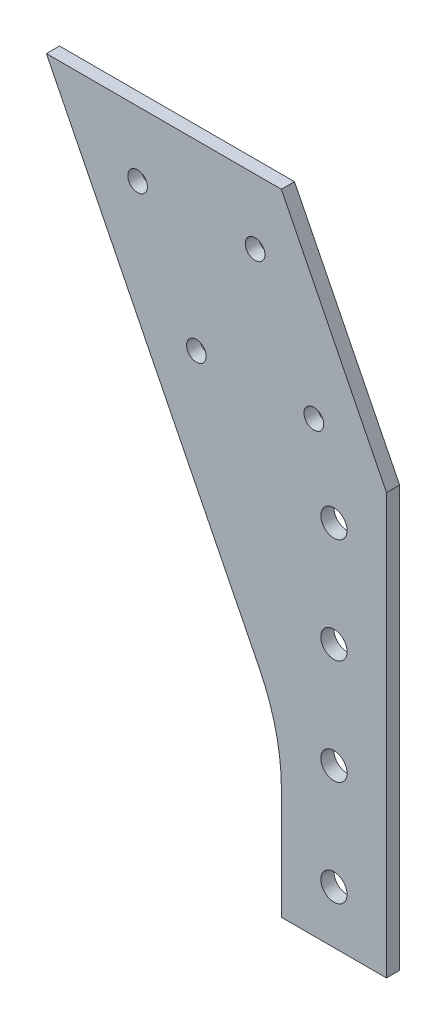
ISO-10303-21;
HEADER;
FILE_DESCRIPTION(('STEP AP214'),'2;1');
FILE_NAME('part.step','',(''),(''),'','','');
FILE_SCHEMA(('AUTOMOTIVE_DESIGN { 1 0 10303 214 1 1 1 1 }'));
ENDSEC;
DATA;
#1=APPLICATION_CONTEXT('core data for automotive mechanical design processes');
#2=APPLICATION_PROTOCOL_DEFINITION('international standard','automotive_design',2000,#1);
#3=PRODUCT_CONTEXT('',#1,'mechanical');
#4=PRODUCT('Part','Part','',(#3));
#5=PRODUCT_RELATED_PRODUCT_CATEGORY('part','',(#4));
#6=PRODUCT_DEFINITION_FORMATION('','',#4);
#7=PRODUCT_DEFINITION_CONTEXT('part definition',#1,'design');
#8=PRODUCT_DEFINITION('design','',#6,#7);
#9=PRODUCT_DEFINITION_SHAPE('','',#8);
#10=(LENGTH_UNIT() NAMED_UNIT(*) SI_UNIT(.MILLI.,.METRE.));
#11=(NAMED_UNIT(*) PLANE_ANGLE_UNIT() SI_UNIT($,.RADIAN.));
#12=(NAMED_UNIT(*) SI_UNIT($,.STERADIAN.) SOLID_ANGLE_UNIT());
#13=UNCERTAINTY_MEASURE_WITH_UNIT(LENGTH_MEASURE(1.E-05),#10,'distance_accuracy_value','');
#14=(GEOMETRIC_REPRESENTATION_CONTEXT(3) GLOBAL_UNCERTAINTY_ASSIGNED_CONTEXT((#13)) GLOBAL_UNIT_ASSIGNED_CONTEXT((#10,
#11,#12)) REPRESENTATION_CONTEXT('',''));
#15=CARTESIAN_POINT('',(0.,0.,0.));
#16=DIRECTION('',(0.,0.,1.));
#17=DIRECTION('',(1.,0.,0.));
#18=AXIS2_PLACEMENT_3D('',#15,#16,#17);
#19=CARTESIAN_POINT('',(-25.1145002991139,-12.5599617930645,3.175));
#20=DIRECTION('',(0.89438856037009,0.447290848418698,0.));
#21=DIRECTION('',(-0.447290848418698,0.89438856037009,0.));
#22=AXIS2_PLACEMENT_3D('',#19,#20,#21);
#23=PLANE('',#22);
#24=DIRECTION('',(0.447290848418698,-0.89438856037009,0.));
#25=VECTOR('',#24,1.);
#26=CARTESIAN_POINT('',(-25.1145002991139,-12.5599617930645,3.175));
#27=LINE('',#26,#25);
#28=CARTESIAN_POINT('',(-69.5040647179644,76.2,3.175));
#29=VERTEX_POINT('',#28);
#30=CARTESIAN_POINT('',(-18.0650611331994,-26.6557962357064,3.175));
#31=VERTEX_POINT('',#30);
#32=EDGE_CURVE('E61',#29,#31,#27,.T.);
#33=ORIENTED_EDGE('',*,*,#32,.F.);
#34=DIRECTION('',(0.,0.,-1.));
#35=VECTOR('',#34,1.);
#36=CARTESIAN_POINT('',(-69.5040647179644,76.2,3.175));
#37=LINE('',#36,#35);
#38=CARTESIAN_POINT('',(-69.5040647179644,76.2,0.));
#39=VERTEX_POINT('',#38);
#40=EDGE_CURVE('E98',#29,#39,#37,.T.);
#41=ORIENTED_EDGE('',*,*,#40,.T.);
#42=DIRECTION('',(0.447290848418698,-0.89438856037009,0.));
#43=VECTOR('',#42,1.);
#44=CARTESIAN_POINT('',(-25.1145002991139,-12.5599617930645,0.));
#45=LINE('',#44,#43);
#46=CARTESIAN_POINT('',(-18.0650611331994,-26.6557962357064,0.));
#47=VERTEX_POINT('',#46);
#48=EDGE_CURVE('E106',#39,#47,#45,.T.);
#49=ORIENTED_EDGE('',*,*,#48,.T.);
#50=DIRECTION('',(0.,0.,-1.));
#51=VECTOR('',#50,1.);
#52=CARTESIAN_POINT('',(-18.0650611331994,-26.6557962357064,3.175));
#53=LINE('',#52,#51);
#54=EDGE_CURVE('E142',#47,#31,#53,.F.);
#55=ORIENTED_EDGE('',*,*,#54,.T.);
#56=EDGE_LOOP('',(#33,#41,#49,#55));
#57=FACE_BOUND('',#56,.T.);
#58=ADVANCED_FACE('F39',(#57),#23,.F.);
#59=CARTESIAN_POINT('',(-12.7,0.,3.175));
#60=DIRECTION('',(1.,0.,0.));
#61=DIRECTION('',(0.,1.,0.));
#62=AXIS2_PLACEMENT_3D('',#59,#60,#61);
#63=PLANE('',#62);
#64=DIRECTION('',(0.,-1.,0.));
#65=VECTOR('',#64,1.);
#66=CARTESIAN_POINT('',(-12.7,0.,3.175));
#67=LINE('',#66,#65);
#68=CARTESIAN_POINT('',(-12.7,-49.3781713353763,3.175));
#69=VERTEX_POINT('',#68);
#70=CARTESIAN_POINT('',(-12.7,-76.2,3.175));
#71=VERTEX_POINT('',#70);
#72=EDGE_CURVE('E149',#69,#71,#67,.T.);
#73=ORIENTED_EDGE('',*,*,#72,.F.);
#74=DIRECTION('',(0.,0.,-1.));
#75=VECTOR('',#74,1.);
#76=CARTESIAN_POINT('',(-12.7,-49.3781713353763,0.));
#77=LINE('',#76,#75);
#78=CARTESIAN_POINT('',(-12.7,-49.3781713353763,0.));
#79=VERTEX_POINT('',#78);
#80=EDGE_CURVE('E139',#69,#79,#77,.T.);
#81=ORIENTED_EDGE('',*,*,#80,.T.);
#82=DIRECTION('',(0.,-1.,0.));
#83=VECTOR('',#82,1.);
#84=CARTESIAN_POINT('',(-12.7,0.,0.));
#85=LINE('',#84,#83);
#86=CARTESIAN_POINT('',(-12.7,-76.2,0.));
#87=VERTEX_POINT('',#86);
#88=EDGE_CURVE('E113',#79,#87,#85,.T.);
#89=ORIENTED_EDGE('',*,*,#88,.T.);
#90=DIRECTION('',(0.,0.,-1.));
#91=VECTOR('',#90,1.);
#92=CARTESIAN_POINT('',(-12.7,-76.2,3.175));
#93=LINE('',#92,#91);
#94=EDGE_CURVE('E136',#71,#87,#93,.T.);
#95=ORIENTED_EDGE('',*,*,#94,.F.);
#96=EDGE_LOOP('',(#73,#81,#89,#95));
#97=FACE_BOUND('',#96,.T.);
#98=ADVANCED_FACE('F152',(#97),#63,.F.);
#99=CARTESIAN_POINT('',(0.,-76.2,3.175));
#100=DIRECTION('',(0.,1.,0.));
#101=DIRECTION('',(0.,0.,1.));
#102=AXIS2_PLACEMENT_3D('',#99,#100,#101);
#103=PLANE('',#102);
#104=DIRECTION('',(1.,0.,0.));
#105=VECTOR('',#104,1.);
#106=CARTESIAN_POINT('',(0.,-76.2,0.));
#107=LINE('',#106,#105);
#108=CARTESIAN_POINT('',(12.7,-76.2,0.));
#109=VERTEX_POINT('',#108);
#110=EDGE_CURVE('E116',#87,#109,#107,.T.);
#111=ORIENTED_EDGE('',*,*,#110,.T.);
#112=DIRECTION('',(0.,0.,-1.));
#113=VECTOR('',#112,1.);
#114=CARTESIAN_POINT('',(12.7,-76.2,3.175));
#115=LINE('',#114,#113);
#116=CARTESIAN_POINT('',(12.7,-76.2,3.175));
#117=VERTEX_POINT('',#116);
#118=EDGE_CURVE('E134',#117,#109,#115,.T.);
#119=ORIENTED_EDGE('',*,*,#118,.F.);
#120=DIRECTION('',(1.,0.,0.));
#121=VECTOR('',#120,1.);
#122=CARTESIAN_POINT('',(0.,-76.2,3.175));
#123=LINE('',#122,#121);
#124=EDGE_CURVE('E154',#71,#117,#123,.T.);
#125=ORIENTED_EDGE('',*,*,#124,.F.);
#126=ORIENTED_EDGE('',*,*,#94,.T.);
#127=EDGE_LOOP('',(#111,#119,#125,#126));
#128=FACE_BOUND('',#127,.T.);
#129=ADVANCED_FACE('F239',(#128),#103,.F.);
#130=CARTESIAN_POINT('',(12.7,0.,3.175));
#131=DIRECTION('',(1.,0.,0.));
#132=DIRECTION('',(0.,1.,0.));
#133=AXIS2_PLACEMENT_3D('',#130,#131,#132);
#134=PLANE('',#133);
#135=DIRECTION('',(0.,-1.,0.));
#136=VECTOR('',#135,1.);
#137=CARTESIAN_POINT('',(12.7,0.,0.));
#138=LINE('',#137,#136);
#139=CARTESIAN_POINT('',(12.7,25.4,0.));
#140=VERTEX_POINT('',#139);
#141=EDGE_CURVE('E127',#140,#109,#138,.T.);
#142=ORIENTED_EDGE('',*,*,#141,.F.);
#143=DIRECTION('',(0.,0.,-1.));
#144=VECTOR('',#143,1.);
#145=CARTESIAN_POINT('',(12.7,25.4,3.175));
#146=LINE('',#145,#144);
#147=CARTESIAN_POINT('',(12.7,25.4,3.175));
#148=VERTEX_POINT('',#147);
#149=EDGE_CURVE('E132',#148,#140,#146,.T.);
#150=ORIENTED_EDGE('',*,*,#149,.F.);
#151=DIRECTION('',(0.,-1.,0.));
#152=VECTOR('',#151,1.);
#153=CARTESIAN_POINT('',(12.7,0.,3.175));
#154=LINE('',#153,#152);
#155=EDGE_CURVE('E156',#148,#117,#154,.T.);
#156=ORIENTED_EDGE('',*,*,#155,.T.);
#157=ORIENTED_EDGE('',*,*,#118,.T.);
#158=EDGE_LOOP('',(#142,#150,#156,#157));
#159=FACE_BOUND('',#158,.T.);
#160=ADVANCED_FACE('F244',(#159),#134,.T.);
#161=CARTESIAN_POINT('',(20.3204385676866,10.1624133066053,3.175));
#162=DIRECTION('',(-0.894388560370089,-0.447290848418698,0.));
#163=DIRECTION('',(0.447290848418698,-0.89438856037009,0.));
#164=AXIS2_PLACEMENT_3D('',#161,#162,#163);
#165=PLANE('',#164);
#166=DIRECTION('',(-0.447290848418698,0.89438856037009,0.));
#167=VECTOR('',#166,1.);
#168=CARTESIAN_POINT('',(20.3204385676866,10.1624133066053,0.));
#169=LINE('',#168,#167);
#170=CARTESIAN_POINT('',(-12.7054849385233,76.2,0.));
#171=VERTEX_POINT('',#170);
#172=EDGE_CURVE('E130',#140,#171,#169,.T.);
#173=ORIENTED_EDGE('',*,*,#172,.T.);
#174=DIRECTION('',(0.,0.,1.));
#175=VECTOR('',#174,1.);
#176=CARTESIAN_POINT('',(-12.7054849385233,76.2,3.175));
#177=LINE('',#176,#175);
#178=CARTESIAN_POINT('',(-12.7054849385233,76.2,3.175));
#179=VERTEX_POINT('',#178);
#180=EDGE_CURVE('E54',#171,#179,#177,.T.);
#181=ORIENTED_EDGE('',*,*,#180,.T.);
#182=DIRECTION('',(-0.447290848418698,0.89438856037009,0.));
#183=VECTOR('',#182,1.);
#184=CARTESIAN_POINT('',(20.3204385676866,10.1624133066053,3.175));
#185=LINE('',#184,#183);
#186=EDGE_CURVE('E122',#148,#179,#185,.T.);
#187=ORIENTED_EDGE('',*,*,#186,.F.);
#188=ORIENTED_EDGE('',*,*,#149,.T.);
#189=EDGE_LOOP('',(#173,#181,#187,#188));
#190=FACE_BOUND('',#189,.T.);
#191=ADVANCED_FACE('F166',(#190),#165,.F.);
#192=CARTESIAN_POINT('',(0.,0.,3.175));
#193=DIRECTION('',(0.,0.,1.));
#194=DIRECTION('',(1.,0.,0.));
#195=AXIS2_PLACEMENT_3D('',#192,#193,#194);
#196=PLANE('',#195);
#197=DIRECTION('',(-1.,0.,0.));
#198=VECTOR('',#197,1.);
#199=CARTESIAN_POINT('',(17.2590744713261,76.2,3.175));
#200=LINE('',#199,#198);
#201=EDGE_CURVE('E103',#179,#29,#200,.T.);
#202=ORIENTED_EDGE('',*,*,#201,.T.);
#203=ORIENTED_EDGE('',*,*,#32,.T.);
#204=CARTESIAN_POINT('',(-63.5,-49.3781713353763,3.175));
#205=DIRECTION('',(0.,0.,1.));
#206=DIRECTION('',(1.,0.,0.));
#207=AXIS2_PLACEMENT_3D('',#204,#205,#206);
#208=CIRCLE('',#207,50.8);
#209=EDGE_CURVE('E11',#31,#69,#208,.F.);
#210=ORIENTED_EDGE('',*,*,#209,.T.);
#211=ORIENTED_EDGE('',*,*,#72,.T.);
#212=ORIENTED_EDGE('',*,*,#124,.T.);
#213=ORIENTED_EDGE('',*,*,#155,.F.);
#214=ORIENTED_EDGE('',*,*,#186,.T.);
#215=EDGE_LOOP('',(#202,#203,#210,#211,#212,#213,#214));
#216=FACE_BOUND('',#215,.T.);
#217=CARTESIAN_POINT('',(-4.8535322434271,32.1063264164993,3.175));
#218=DIRECTION('',(0.,0.,-1.));
#219=DIRECTION('',(-1.,0.,0.));
#220=AXIS2_PLACEMENT_3D('',#217,#218,#219);
#221=CIRCLE('',#220,2.38125);
#222=CARTESIAN_POINT('',(-7.2347822434271,32.1063264164993,3.175));
#223=VERTEX_POINT('',#222);
#224=EDGE_CURVE('E173',#223,#223,#221,.T.);
#225=ORIENTED_EDGE('',*,*,#224,.T.);
#226=EDGE_LOOP('',(#225));
#227=FACE_BOUND('',#226,.T.);
#228=CARTESIAN_POINT('',(-47.4543065704413,60.5031632082497,3.175));
#229=DIRECTION('',(0.,0.,-1.));
#230=DIRECTION('',(-1.,0.,0.));
#231=AXIS2_PLACEMENT_3D('',#228,#229,#230);
#232=CIRCLE('',#231,2.38125);
#233=CARTESIAN_POINT('',(-49.8355565704413,60.5031632082497,3.175));
#234=VERTEX_POINT('',#233);
#235=EDGE_CURVE('E180',#234,#234,#232,.T.);
#236=ORIENTED_EDGE('',*,*,#235,.T.);
#237=EDGE_LOOP('',(#236));
#238=FACE_BOUND('',#237,.T.);
#239=CARTESIAN_POINT('',(-19.0550166807208,60.5031632082497,3.175));
#240=DIRECTION('',(0.,0.,-1.));
#241=DIRECTION('',(-1.,0.,0.));
#242=AXIS2_PLACEMENT_3D('',#239,#240,#241);
#243=CIRCLE('',#242,2.38125);
#244=CARTESIAN_POINT('',(-21.4362666807208,60.5031632082497,3.175));
#245=VERTEX_POINT('',#244);
#246=EDGE_CURVE('E179',#245,#245,#243,.T.);
#247=ORIENTED_EDGE('',*,*,#246,.T.);
#248=EDGE_LOOP('',(#247));
#249=FACE_BOUND('',#248,.T.);
#250=CARTESIAN_POINT('',(-33.2528221331476,32.1063264164993,3.175));
#251=DIRECTION('',(0.,0.,-1.));
#252=DIRECTION('',(-1.,0.,0.));
#253=AXIS2_PLACEMENT_3D('',#250,#251,#252);
#254=CIRCLE('',#253,2.38125);
#255=CARTESIAN_POINT('',(-35.6340721331476,32.1063264164993,3.175));
#256=VERTEX_POINT('',#255);
#257=EDGE_CURVE('E108',#256,#256,#254,.T.);
#258=ORIENTED_EDGE('',*,*,#257,.T.);
#259=EDGE_LOOP('',(#258));
#260=FACE_BOUND('',#259,.T.);
#261=CARTESIAN_POINT('',(0.,-63.5,3.175));
#262=DIRECTION('',(0.,0.,-1.));
#263=DIRECTION('',(-1.,0.,0.));
#264=AXIS2_PLACEMENT_3D('',#261,#262,#263);
#265=CIRCLE('',#264,3.175);
#266=CARTESIAN_POINT('',(-3.17499999999999,-63.5,3.175));
#267=VERTEX_POINT('',#266);
#268=EDGE_CURVE('E114',#267,#267,#265,.T.);
#269=ORIENTED_EDGE('',*,*,#268,.T.);
#270=EDGE_LOOP('',(#269));
#271=FACE_BOUND('',#270,.T.);
#272=CARTESIAN_POINT('',(0.,-38.1,3.175));
#273=DIRECTION('',(0.,0.,-1.));
#274=DIRECTION('',(-1.,0.,0.));
#275=AXIS2_PLACEMENT_3D('',#272,#273,#274);
#276=CIRCLE('',#275,3.175);
#277=CARTESIAN_POINT('',(-3.17499999999999,-38.1,3.175));
#278=VERTEX_POINT('',#277);
#279=EDGE_CURVE('E199',#278,#278,#276,.T.);
#280=ORIENTED_EDGE('',*,*,#279,.T.);
#281=EDGE_LOOP('',(#280));
#282=FACE_BOUND('',#281,.T.);
#283=CARTESIAN_POINT('',(0.,-12.7,3.175));
#284=DIRECTION('',(0.,0.,-1.));
#285=DIRECTION('',(-1.,0.,0.));
#286=AXIS2_PLACEMENT_3D('',#283,#284,#285);
#287=CIRCLE('',#286,3.175);
#288=CARTESIAN_POINT('',(-3.17499999999999,-12.7,3.175));
#289=VERTEX_POINT('',#288);
#290=EDGE_CURVE('E205',#289,#289,#287,.T.);
#291=ORIENTED_EDGE('',*,*,#290,.T.);
#292=EDGE_LOOP('',(#291));
#293=FACE_BOUND('',#292,.T.);
#294=CARTESIAN_POINT('',(0.,12.7,3.175));
#295=DIRECTION('',(0.,0.,-1.));
#296=DIRECTION('',(-1.,0.,0.));
#297=AXIS2_PLACEMENT_3D('',#294,#295,#296);
#298=CIRCLE('',#297,3.175);
#299=CARTESIAN_POINT('',(-3.17499999999999,12.7,3.175));
#300=VERTEX_POINT('',#299);
#301=EDGE_CURVE('E191',#300,#300,#298,.T.);
#302=ORIENTED_EDGE('',*,*,#301,.T.);
#303=EDGE_LOOP('',(#302));
#304=FACE_BOUND('',#303,.T.);
#305=ADVANCED_FACE('F147',(#216,#227,#238,#249,#260,#271,#282,#293,#304),#196,.T.);
#306=CARTESIAN_POINT('',(0.,0.,0.));
#307=DIRECTION('',(0.,0.,1.));
#308=DIRECTION('',(1.,0.,0.));
#309=AXIS2_PLACEMENT_3D('',#306,#307,#308);
#310=PLANE('',#309);
#311=CARTESIAN_POINT('',(-4.8535322434271,32.1063264164993,0.));
#312=DIRECTION('',(0.,0.,-1.));
#313=DIRECTION('',(-1.,0.,0.));
#314=AXIS2_PLACEMENT_3D('',#311,#312,#313);
#315=CIRCLE('',#314,2.38125);
#316=CARTESIAN_POINT('',(-7.2347822434271,32.1063264164993,0.));
#317=VERTEX_POINT('',#316);
#318=EDGE_CURVE('E183',#317,#317,#315,.T.);
#319=ORIENTED_EDGE('',*,*,#318,.F.);
#320=EDGE_LOOP('',(#319));
#321=FACE_BOUND('',#320,.T.);
#322=CARTESIAN_POINT('',(-47.4543065704413,60.5031632082497,0.));
#323=DIRECTION('',(0.,0.,-1.));
#324=DIRECTION('',(-1.,0.,0.));
#325=AXIS2_PLACEMENT_3D('',#322,#323,#324);
#326=CIRCLE('',#325,2.38125);
#327=CARTESIAN_POINT('',(-49.8355565704413,60.5031632082497,0.));
#328=VERTEX_POINT('',#327);
#329=EDGE_CURVE('E176',#328,#328,#326,.T.);
#330=ORIENTED_EDGE('',*,*,#329,.F.);
#331=EDGE_LOOP('',(#330));
#332=FACE_BOUND('',#331,.T.);
#333=CARTESIAN_POINT('',(-19.0550166807208,60.5031632082497,0.));
#334=DIRECTION('',(0.,0.,-1.));
#335=DIRECTION('',(-1.,0.,0.));
#336=AXIS2_PLACEMENT_3D('',#333,#334,#335);
#337=CIRCLE('',#336,2.38125);
#338=CARTESIAN_POINT('',(-21.4362666807208,60.5031632082497,0.));
#339=VERTEX_POINT('',#338);
#340=EDGE_CURVE('E188',#339,#339,#337,.T.);
#341=ORIENTED_EDGE('',*,*,#340,.F.);
#342=EDGE_LOOP('',(#341));
#343=FACE_BOUND('',#342,.T.);
#344=CARTESIAN_POINT('',(-33.2528221331476,32.1063264164993,0.));
#345=DIRECTION('',(0.,0.,-1.));
#346=DIRECTION('',(-1.,0.,0.));
#347=AXIS2_PLACEMENT_3D('',#344,#345,#346);
#348=CIRCLE('',#347,2.38125);
#349=CARTESIAN_POINT('',(-35.6340721331476,32.1063264164993,0.));
#350=VERTEX_POINT('',#349);
#351=EDGE_CURVE('E170',#350,#350,#348,.T.);
#352=ORIENTED_EDGE('',*,*,#351,.F.);
#353=EDGE_LOOP('',(#352));
#354=FACE_BOUND('',#353,.T.);
#355=CARTESIAN_POINT('',(0.,-63.5,0.));
#356=DIRECTION('',(0.,0.,-1.));
#357=DIRECTION('',(-1.,0.,0.));
#358=AXIS2_PLACEMENT_3D('',#355,#356,#357);
#359=CIRCLE('',#358,3.175);
#360=CARTESIAN_POINT('',(-3.17499999999999,-63.5,0.));
#361=VERTEX_POINT('',#360);
#362=EDGE_CURVE('E119',#361,#361,#359,.T.);
#363=ORIENTED_EDGE('',*,*,#362,.F.);
#364=EDGE_LOOP('',(#363));
#365=FACE_BOUND('',#364,.T.);
#366=CARTESIAN_POINT('',(0.,-38.1,0.));
#367=DIRECTION('',(0.,0.,-1.));
#368=DIRECTION('',(-1.,0.,0.));
#369=AXIS2_PLACEMENT_3D('',#366,#367,#368);
#370=CIRCLE('',#369,3.175);
#371=CARTESIAN_POINT('',(-3.17499999999999,-38.1,0.));
#372=VERTEX_POINT('',#371);
#373=EDGE_CURVE('E196',#372,#372,#370,.T.);
#374=ORIENTED_EDGE('',*,*,#373,.F.);
#375=EDGE_LOOP('',(#374));
#376=FACE_BOUND('',#375,.T.);
#377=CARTESIAN_POINT('',(0.,-12.7,0.));
#378=DIRECTION('',(0.,0.,-1.));
#379=DIRECTION('',(-1.,0.,0.));
#380=AXIS2_PLACEMENT_3D('',#377,#378,#379);
#381=CIRCLE('',#380,3.175);
#382=CARTESIAN_POINT('',(-3.17499999999999,-12.7,0.));
#383=VERTEX_POINT('',#382);
#384=EDGE_CURVE('E202',#383,#383,#381,.T.);
#385=ORIENTED_EDGE('',*,*,#384,.F.);
#386=EDGE_LOOP('',(#385));
#387=FACE_BOUND('',#386,.T.);
#388=CARTESIAN_POINT('',(0.,12.7,0.));
#389=DIRECTION('',(0.,0.,-1.));
#390=DIRECTION('',(-1.,0.,0.));
#391=AXIS2_PLACEMENT_3D('',#388,#389,#390);
#392=CIRCLE('',#391,3.175);
#393=CARTESIAN_POINT('',(-3.17499999999999,12.7,0.));
#394=VERTEX_POINT('',#393);
#395=EDGE_CURVE('E208',#394,#394,#392,.T.);
#396=ORIENTED_EDGE('',*,*,#395,.F.);
#397=EDGE_LOOP('',(#396));
#398=FACE_BOUND('',#397,.T.);
#399=ORIENTED_EDGE('',*,*,#48,.F.);
#400=DIRECTION('',(-1.,0.,0.));
#401=VECTOR('',#400,1.);
#402=CARTESIAN_POINT('',(17.2590744713261,76.2,0.));
#403=LINE('',#402,#401);
#404=EDGE_CURVE('E95',#171,#39,#403,.T.);
#405=ORIENTED_EDGE('',*,*,#404,.F.);
#406=ORIENTED_EDGE('',*,*,#172,.F.);
#407=ORIENTED_EDGE('',*,*,#141,.T.);
#408=ORIENTED_EDGE('',*,*,#110,.F.);
#409=ORIENTED_EDGE('',*,*,#88,.F.);
#410=CARTESIAN_POINT('',(-63.5,-49.3781713353763,0.));
#411=DIRECTION('',(0.,0.,1.));
#412=DIRECTION('',(1.,0.,0.));
#413=AXIS2_PLACEMENT_3D('',#410,#411,#412);
#414=CIRCLE('',#413,50.8);
#415=EDGE_CURVE('E47',#79,#47,#414,.T.);
#416=ORIENTED_EDGE('',*,*,#415,.T.);
#417=EDGE_LOOP('',(#399,#405,#406,#407,#408,#409,#416));
#418=FACE_BOUND('',#417,.T.);
#419=ADVANCED_FACE('F110',(#321,#332,#343,#354,#365,#376,#387,#398,#418),#310,.F.);
#420=CARTESIAN_POINT('',(-63.5,-49.3781713353763,3.175));
#421=DIRECTION('',(0.,0.,1.));
#422=DIRECTION('',(1.,0.,0.));
#423=AXIS2_PLACEMENT_3D('',#420,#421,#422);
#424=CYLINDRICAL_SURFACE('',#423,50.8);
#425=ORIENTED_EDGE('',*,*,#209,.F.);
#426=ORIENTED_EDGE('',*,*,#54,.F.);
#427=ORIENTED_EDGE('',*,*,#415,.F.);
#428=ORIENTED_EDGE('',*,*,#80,.F.);
#429=EDGE_LOOP('',(#425,#426,#427,#428));
#430=FACE_BOUND('',#429,.T.);
#431=ADVANCED_FACE('F41',(#430),#424,.F.);
#432=CARTESIAN_POINT('',(0.,12.7,3.175));
#433=DIRECTION('',(0.,0.,-1.));
#434=DIRECTION('',(-1.,0.,0.));
#435=AXIS2_PLACEMENT_3D('',#432,#433,#434);
#436=CYLINDRICAL_SURFACE('',#435,3.175);
#437=ORIENTED_EDGE('',*,*,#301,.F.);
#438=EDGE_LOOP('',(#437));
#439=FACE_BOUND('',#438,.T.);
#440=ORIENTED_EDGE('',*,*,#395,.T.);
#441=EDGE_LOOP('',(#440));
#442=FACE_BOUND('',#441,.T.);
#443=ADVANCED_FACE('F214',(#439,#442),#436,.F.);
#444=CARTESIAN_POINT('',(0.,-12.7,3.175));
#445=DIRECTION('',(0.,0.,-1.));
#446=DIRECTION('',(-1.,0.,0.));
#447=AXIS2_PLACEMENT_3D('',#444,#445,#446);
#448=CYLINDRICAL_SURFACE('',#447,3.175);
#449=ORIENTED_EDGE('',*,*,#290,.F.);
#450=EDGE_LOOP('',(#449));
#451=FACE_BOUND('',#450,.T.);
#452=ORIENTED_EDGE('',*,*,#384,.T.);
#453=EDGE_LOOP('',(#452));
#454=FACE_BOUND('',#453,.T.);
#455=ADVANCED_FACE('F217',(#451,#454),#448,.F.);
#456=CARTESIAN_POINT('',(0.,-38.1,3.175));
#457=DIRECTION('',(0.,0.,-1.));
#458=DIRECTION('',(-1.,0.,0.));
#459=AXIS2_PLACEMENT_3D('',#456,#457,#458);
#460=CYLINDRICAL_SURFACE('',#459,3.175);
#461=ORIENTED_EDGE('',*,*,#279,.F.);
#462=EDGE_LOOP('',(#461));
#463=FACE_BOUND('',#462,.T.);
#464=ORIENTED_EDGE('',*,*,#373,.T.);
#465=EDGE_LOOP('',(#464));
#466=FACE_BOUND('',#465,.T.);
#467=ADVANCED_FACE('F277',(#463,#466),#460,.F.);
#468=CARTESIAN_POINT('',(0.,-63.5,3.175));
#469=DIRECTION('',(0.,0.,-1.));
#470=DIRECTION('',(-1.,0.,0.));
#471=AXIS2_PLACEMENT_3D('',#468,#469,#470);
#472=CYLINDRICAL_SURFACE('',#471,3.175);
#473=ORIENTED_EDGE('',*,*,#268,.F.);
#474=EDGE_LOOP('',(#473));
#475=FACE_BOUND('',#474,.T.);
#476=ORIENTED_EDGE('',*,*,#362,.T.);
#477=EDGE_LOOP('',(#476));
#478=FACE_BOUND('',#477,.T.);
#479=ADVANCED_FACE('F285',(#475,#478),#472,.F.);
#480=CARTESIAN_POINT('',(-33.2528221331476,32.1063264164993,3.175));
#481=DIRECTION('',(0.,0.,-1.));
#482=DIRECTION('',(-1.,0.,0.));
#483=AXIS2_PLACEMENT_3D('',#480,#481,#482);
#484=CYLINDRICAL_SURFACE('',#483,2.38125);
#485=ORIENTED_EDGE('',*,*,#257,.F.);
#486=EDGE_LOOP('',(#485));
#487=FACE_BOUND('',#486,.T.);
#488=ORIENTED_EDGE('',*,*,#351,.T.);
#489=EDGE_LOOP('',(#488));
#490=FACE_BOUND('',#489,.T.);
#491=ADVANCED_FACE('F293',(#487,#490),#484,.F.);
#492=CARTESIAN_POINT('',(-19.0550166807208,60.5031632082497,3.175));
#493=DIRECTION('',(0.,0.,-1.));
#494=DIRECTION('',(-1.,0.,0.));
#495=AXIS2_PLACEMENT_3D('',#492,#493,#494);
#496=CYLINDRICAL_SURFACE('',#495,2.38125);
#497=ORIENTED_EDGE('',*,*,#246,.F.);
#498=EDGE_LOOP('',(#497));
#499=FACE_BOUND('',#498,.T.);
#500=ORIENTED_EDGE('',*,*,#340,.T.);
#501=EDGE_LOOP('',(#500));
#502=FACE_BOUND('',#501,.T.);
#503=ADVANCED_FACE('F301',(#499,#502),#496,.F.);
#504=CARTESIAN_POINT('',(-47.4543065704413,60.5031632082497,3.175));
#505=DIRECTION('',(0.,0.,-1.));
#506=DIRECTION('',(-1.,0.,0.));
#507=AXIS2_PLACEMENT_3D('',#504,#505,#506);
#508=CYLINDRICAL_SURFACE('',#507,2.38125);
#509=ORIENTED_EDGE('',*,*,#235,.F.);
#510=EDGE_LOOP('',(#509));
#511=FACE_BOUND('',#510,.T.);
#512=ORIENTED_EDGE('',*,*,#329,.T.);
#513=EDGE_LOOP('',(#512));
#514=FACE_BOUND('',#513,.T.);
#515=ADVANCED_FACE('F309',(#511,#514),#508,.F.);
#516=CARTESIAN_POINT('',(-4.8535322434271,32.1063264164993,3.175));
#517=DIRECTION('',(0.,0.,-1.));
#518=DIRECTION('',(-1.,0.,0.));
#519=AXIS2_PLACEMENT_3D('',#516,#517,#518);
#520=CYLINDRICAL_SURFACE('',#519,2.38125);
#521=ORIENTED_EDGE('',*,*,#224,.F.);
#522=EDGE_LOOP('',(#521));
#523=FACE_BOUND('',#522,.T.);
#524=ORIENTED_EDGE('',*,*,#318,.T.);
#525=EDGE_LOOP('',(#524));
#526=FACE_BOUND('',#525,.T.);
#527=ADVANCED_FACE('F317',(#523,#526),#520,.F.);
#528=CARTESIAN_POINT('',(17.2590744713261,76.2,3.175));
#529=DIRECTION('',(0.,-1.,0.));
#530=DIRECTION('',(0.,0.,-1.));
#531=AXIS2_PLACEMENT_3D('',#528,#529,#530);
#532=PLANE('',#531);
#533=ORIENTED_EDGE('',*,*,#201,.F.);
#534=ORIENTED_EDGE('',*,*,#180,.F.);
#535=ORIENTED_EDGE('',*,*,#404,.T.);
#536=ORIENTED_EDGE('',*,*,#40,.F.);
#537=EDGE_LOOP('',(#533,#534,#535,#536));
#538=FACE_BOUND('',#537,.T.);
#539=ADVANCED_FACE('F97',(#538),#532,.F.);
#540=CLOSED_SHELL('',(#58,#98,#129,#160,#191,#305,#419,#431,#443,#455,#467,#479,#491,#503,#515,
#527,#539));
#541=MANIFOLD_SOLID_BREP('B2',#540);
#542=ADVANCED_BREP_SHAPE_REPRESENTATION('',(#18,#541),#14);
#543=SHAPE_DEFINITION_REPRESENTATION(#9,#542);
ENDSEC;
END-ISO-10303-21;
